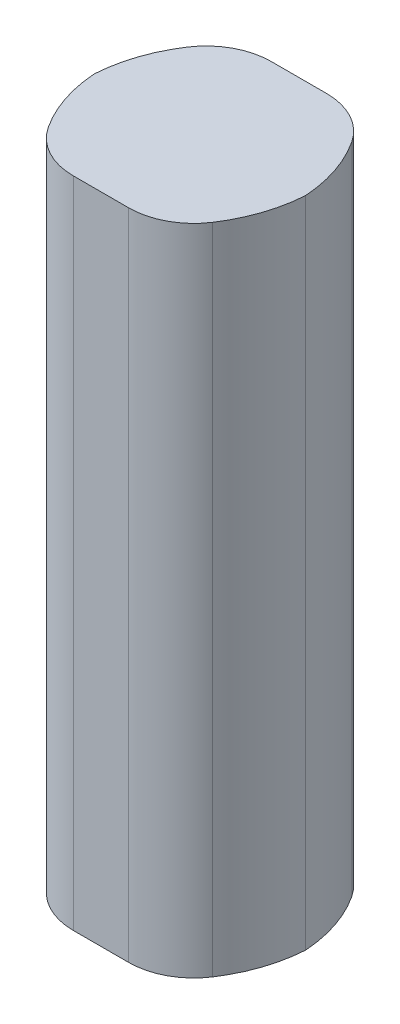
ISO-10303-21;
HEADER;
FILE_DESCRIPTION(('STEP AP214'),'2;1');
FILE_NAME('part.step','',(''),(''),'','','');
FILE_SCHEMA(('AUTOMOTIVE_DESIGN { 1 0 10303 214 1 1 1 1 }'));
ENDSEC;
DATA;
#1=APPLICATION_CONTEXT('core data for automotive mechanical design processes');
#2=APPLICATION_PROTOCOL_DEFINITION('international standard','automotive_design',2000,#1);
#3=PRODUCT_CONTEXT('',#1,'mechanical');
#4=PRODUCT('Part','Part','',(#3));
#5=PRODUCT_RELATED_PRODUCT_CATEGORY('part','',(#4));
#6=PRODUCT_DEFINITION_FORMATION('','',#4);
#7=PRODUCT_DEFINITION_CONTEXT('part definition',#1,'design');
#8=PRODUCT_DEFINITION('design','',#6,#7);
#9=PRODUCT_DEFINITION_SHAPE('','',#8);
#10=(LENGTH_UNIT() NAMED_UNIT(*) SI_UNIT(.MILLI.,.METRE.));
#11=(NAMED_UNIT(*) PLANE_ANGLE_UNIT() SI_UNIT($,.RADIAN.));
#12=(NAMED_UNIT(*) SI_UNIT($,.STERADIAN.) SOLID_ANGLE_UNIT());
#13=UNCERTAINTY_MEASURE_WITH_UNIT(LENGTH_MEASURE(1.E-05),#10,'distance_accuracy_value','');
#14=(GEOMETRIC_REPRESENTATION_CONTEXT(3) GLOBAL_UNCERTAINTY_ASSIGNED_CONTEXT((#13)) GLOBAL_UNIT_ASSIGNED_CONTEXT((#10,
#11,#12)) REPRESENTATION_CONTEXT('',''));
#15=CARTESIAN_POINT('',(0.,0.,0.));
#16=DIRECTION('',(0.,0.,1.));
#17=DIRECTION('',(1.,0.,0.));
#18=AXIS2_PLACEMENT_3D('',#15,#16,#17);
#19=CARTESIAN_POINT('',(-5.75438912917496,100.35,1.4159088829309));
#20=DIRECTION('',(0.,-1.,0.));
#21=DIRECTION('',(0.,0.,-1.));
#22=AXIS2_PLACEMENT_3D('',#19,#20,#21);
#23=CYLINDRICAL_SURFACE('',#22,22.);
#24=CARTESIAN_POINT('',(-5.75438912917496,0.,1.4159088829309));
#25=DIRECTION('',(0.,1.,0.));
#26=DIRECTION('',(0.,0.,1.));
#27=AXIS2_PLACEMENT_3D('',#24,#25,#26);
#28=CIRCLE('',#27,22.);
#29=CARTESIAN_POINT('',(12.59999250633,0.,-10.7132574024424));
#30=VERTEX_POINT('',#29);
#31=CARTESIAN_POINT('',(16.2,0.,0.));
#32=VERTEX_POINT('',#31);
#33=EDGE_CURVE('E177',#30,#32,#28,.F.);
#34=ORIENTED_EDGE('',*,*,#33,.F.);
#35=DIRECTION('',(0.,-1.,0.));
#36=VECTOR('',#35,1.);
#37=CARTESIAN_POINT('',(12.59999250633,100.35,-10.7132574024424));
#38=LINE('',#37,#36);
#39=CARTESIAN_POINT('',(12.59999250633,100.35,-10.7132574024424));
#40=VERTEX_POINT('',#39);
#41=EDGE_CURVE('E44',#30,#40,#38,.F.);
#42=ORIENTED_EDGE('',*,*,#41,.T.);
#43=CARTESIAN_POINT('',(-5.75438912917496,100.35,1.4159088829309));
#44=DIRECTION('',(0.,1.,0.));
#45=DIRECTION('',(0.,0.,1.));
#46=AXIS2_PLACEMENT_3D('',#43,#44,#45);
#47=CIRCLE('',#46,22.);
#48=CARTESIAN_POINT('',(16.2,100.35,0.));
#49=VERTEX_POINT('',#48);
#50=EDGE_CURVE('E174',#40,#49,#47,.F.);
#51=ORIENTED_EDGE('',*,*,#50,.T.);
#52=DIRECTION('',(0.,-1.,0.));
#53=VECTOR('',#52,1.);
#54=CARTESIAN_POINT('',(16.2,100.35,0.));
#55=LINE('',#54,#53);
#56=EDGE_CURVE('E136',#49,#32,#55,.T.);
#57=ORIENTED_EDGE('',*,*,#56,.T.);
#58=EDGE_LOOP('',(#34,#42,#51,#57));
#59=FACE_BOUND('',#58,.T.);
#60=ADVANCED_FACE('F36',(#59),#23,.T.);
#61=CARTESIAN_POINT('',(0.,100.35,-15.2));
#62=DIRECTION('',(0.,0.,-1.));
#63=DIRECTION('',(-1.,0.,0.));
#64=AXIS2_PLACEMENT_3D('',#61,#62,#63);
#65=PLANE('',#64);
#66=DIRECTION('',(1.,0.,0.));
#67=VECTOR('',#66,1.);
#68=CARTESIAN_POINT('',(0.,100.35,-15.2));
#69=LINE('',#68,#67);
#70=CARTESIAN_POINT('',(-4.25709176291859,100.35,-15.2));
#71=VERTEX_POINT('',#70);
#72=CARTESIAN_POINT('',(4.25709176291866,100.35,-15.2));
#73=VERTEX_POINT('',#72);
#74=EDGE_CURVE('E120',#71,#73,#69,.T.);
#75=ORIENTED_EDGE('',*,*,#74,.T.);
#76=DIRECTION('',(0.,-1.,0.));
#77=VECTOR('',#76,1.);
#78=CARTESIAN_POINT('',(4.25709176291866,100.35,-15.2));
#79=LINE('',#78,#77);
#80=CARTESIAN_POINT('',(4.25709176291866,0.,-15.2));
#81=VERTEX_POINT('',#80);
#82=EDGE_CURVE('E167',#73,#81,#79,.T.);
#83=ORIENTED_EDGE('',*,*,#82,.T.);
#84=DIRECTION('',(1.,0.,0.));
#85=VECTOR('',#84,1.);
#86=CARTESIAN_POINT('',(0.,0.,-15.2));
#87=LINE('',#86,#85);
#88=CARTESIAN_POINT('',(-4.25709176291859,0.,-15.2));
#89=VERTEX_POINT('',#88);
#90=EDGE_CURVE('E189',#89,#81,#87,.T.);
#91=ORIENTED_EDGE('',*,*,#90,.F.);
#92=DIRECTION('',(0.,1.,0.));
#93=VECTOR('',#92,1.);
#94=CARTESIAN_POINT('',(-4.25709176291859,100.35,-15.2));
#95=LINE('',#94,#93);
#96=EDGE_CURVE('E165',#89,#71,#95,.T.);
#97=ORIENTED_EDGE('',*,*,#96,.T.);
#98=EDGE_LOOP('',(#75,#83,#91,#97));
#99=FACE_BOUND('',#98,.T.);
#100=ADVANCED_FACE('F188',(#99),#65,.T.);
#101=CARTESIAN_POINT('',(5.75438912917503,100.35,1.41590888293091));
#102=DIRECTION('',(0.,-1.,0.));
#103=DIRECTION('',(0.,0.,-1.));
#104=AXIS2_PLACEMENT_3D('',#101,#102,#103);
#105=CYLINDRICAL_SURFACE('',#104,22.);
#106=CARTESIAN_POINT('',(5.75438912917503,100.35,1.41590888293091));
#107=DIRECTION('',(0.,1.,0.));
#108=DIRECTION('',(0.,0.,1.));
#109=AXIS2_PLACEMENT_3D('',#106,#107,#108);
#110=CIRCLE('',#109,22.);
#111=CARTESIAN_POINT('',(-12.5999925063299,100.35,-10.7132574024424));
#112=VERTEX_POINT('',#111);
#113=CARTESIAN_POINT('',(-16.2,100.35,0.));
#114=VERTEX_POINT('',#113);
#115=EDGE_CURVE('E112',#112,#114,#110,.T.);
#116=ORIENTED_EDGE('',*,*,#115,.F.);
#117=DIRECTION('',(0.,-1.,0.));
#118=VECTOR('',#117,1.);
#119=CARTESIAN_POINT('',(-12.5999925063299,100.35,-10.7132574024424));
#120=LINE('',#119,#118);
#121=CARTESIAN_POINT('',(-12.5999925063299,0.,-10.7132574024424));
#122=VERTEX_POINT('',#121);
#123=EDGE_CURVE('E12',#112,#122,#120,.T.);
#124=ORIENTED_EDGE('',*,*,#123,.T.);
#125=CARTESIAN_POINT('',(5.75438912917503,0.,1.41590888293091));
#126=DIRECTION('',(0.,1.,0.));
#127=DIRECTION('',(0.,0.,1.));
#128=AXIS2_PLACEMENT_3D('',#125,#126,#127);
#129=CIRCLE('',#128,22.);
#130=CARTESIAN_POINT('',(-16.2,0.,0.));
#131=VERTEX_POINT('',#130);
#132=EDGE_CURVE('E133',#122,#131,#129,.T.);
#133=ORIENTED_EDGE('',*,*,#132,.T.);
#134=DIRECTION('',(0.,-1.,0.));
#135=VECTOR('',#134,1.);
#136=CARTESIAN_POINT('',(-16.2,100.35,0.));
#137=LINE('',#136,#135);
#138=EDGE_CURVE('E126',#114,#131,#137,.T.);
#139=ORIENTED_EDGE('',*,*,#138,.F.);
#140=EDGE_LOOP('',(#116,#124,#133,#139));
#141=FACE_BOUND('',#140,.T.);
#142=ADVANCED_FACE('F131',(#141),#105,.T.);
#143=CARTESIAN_POINT('',(5.75438912917503,100.35,-1.41590888293091));
#144=DIRECTION('',(0.,-1.,0.));
#145=DIRECTION('',(0.,0.,-1.));
#146=AXIS2_PLACEMENT_3D('',#143,#144,#145);
#147=CYLINDRICAL_SURFACE('',#146,22.);
#148=CARTESIAN_POINT('',(5.75438912917503,0.,-1.41590888293091));
#149=DIRECTION('',(0.,1.,0.));
#150=DIRECTION('',(0.,0.,1.));
#151=AXIS2_PLACEMENT_3D('',#148,#149,#150);
#152=CIRCLE('',#151,22.);
#153=CARTESIAN_POINT('',(-12.59999250633,0.,10.7132574024424));
#154=VERTEX_POINT('',#153);
#155=EDGE_CURVE('E195',#154,#131,#152,.F.);
#156=ORIENTED_EDGE('',*,*,#155,.F.);
#157=DIRECTION('',(0.,-1.,0.));
#158=VECTOR('',#157,1.);
#159=CARTESIAN_POINT('',(-12.59999250633,100.35,10.7132574024424));
#160=LINE('',#159,#158);
#161=CARTESIAN_POINT('',(-12.59999250633,100.35,10.7132574024424));
#162=VERTEX_POINT('',#161);
#163=EDGE_CURVE('E128',#154,#162,#160,.F.);
#164=ORIENTED_EDGE('',*,*,#163,.T.);
#165=CARTESIAN_POINT('',(5.75438912917503,100.35,-1.41590888293091));
#166=DIRECTION('',(0.,1.,0.));
#167=DIRECTION('',(0.,0.,1.));
#168=AXIS2_PLACEMENT_3D('',#165,#166,#167);
#169=CIRCLE('',#168,22.);
#170=EDGE_CURVE('E115',#162,#114,#169,.F.);
#171=ORIENTED_EDGE('',*,*,#170,.T.);
#172=ORIENTED_EDGE('',*,*,#138,.T.);
#173=EDGE_LOOP('',(#156,#164,#171,#172));
#174=FACE_BOUND('',#173,.T.);
#175=ADVANCED_FACE('F125',(#174),#147,.T.);
#176=CARTESIAN_POINT('',(0.,100.35,15.2));
#177=DIRECTION('',(0.,0.,-1.));
#178=DIRECTION('',(-1.,0.,0.));
#179=AXIS2_PLACEMENT_3D('',#176,#177,#178);
#180=PLANE('',#179);
#181=DIRECTION('',(1.,0.,0.));
#182=VECTOR('',#181,1.);
#183=CARTESIAN_POINT('',(0.,100.35,15.2));
#184=LINE('',#183,#182);
#185=CARTESIAN_POINT('',(-4.2570917629186,100.35,15.2));
#186=VERTEX_POINT('',#185);
#187=CARTESIAN_POINT('',(4.25709176291866,100.35,15.2));
#188=VERTEX_POINT('',#187);
#189=EDGE_CURVE('E129',#186,#188,#184,.T.);
#190=ORIENTED_EDGE('',*,*,#189,.F.);
#191=DIRECTION('',(0.,1.,0.));
#192=VECTOR('',#191,1.);
#193=CARTESIAN_POINT('',(-4.2570917629186,0.,15.2));
#194=LINE('',#193,#192);
#195=CARTESIAN_POINT('',(-4.2570917629186,0.,15.2));
#196=VERTEX_POINT('',#195);
#197=EDGE_CURVE('E138',#186,#196,#194,.F.);
#198=ORIENTED_EDGE('',*,*,#197,.T.);
#199=DIRECTION('',(1.,0.,0.));
#200=VECTOR('',#199,1.);
#201=CARTESIAN_POINT('',(0.,0.,15.2));
#202=LINE('',#201,#200);
#203=CARTESIAN_POINT('',(4.25709176291866,0.,15.2));
#204=VERTEX_POINT('',#203);
#205=EDGE_CURVE('E201',#196,#204,#202,.T.);
#206=ORIENTED_EDGE('',*,*,#205,.T.);
#207=DIRECTION('',(0.,-1.,0.));
#208=VECTOR('',#207,1.);
#209=CARTESIAN_POINT('',(4.25709176291866,100.35,15.2));
#210=LINE('',#209,#208);
#211=EDGE_CURVE('E135',#204,#188,#210,.F.);
#212=ORIENTED_EDGE('',*,*,#211,.T.);
#213=EDGE_LOOP('',(#190,#198,#206,#212));
#214=FACE_BOUND('',#213,.T.);
#215=ADVANCED_FACE('F211',(#214),#180,.F.);
#216=CARTESIAN_POINT('',(-5.75438912917496,100.35,-1.41590888293092));
#217=DIRECTION('',(0.,-1.,0.));
#218=DIRECTION('',(0.,0.,-1.));
#219=AXIS2_PLACEMENT_3D('',#216,#217,#218);
#220=CYLINDRICAL_SURFACE('',#219,22.);
#221=CARTESIAN_POINT('',(-5.75438912917496,100.35,-1.41590888293092));
#222=DIRECTION('',(0.,1.,0.));
#223=DIRECTION('',(0.,0.,1.));
#224=AXIS2_PLACEMENT_3D('',#221,#222,#223);
#225=CIRCLE('',#224,22.);
#226=CARTESIAN_POINT('',(12.59999250633,100.35,10.7132574024424));
#227=VERTEX_POINT('',#226);
#228=EDGE_CURVE('E141',#227,#49,#225,.T.);
#229=ORIENTED_EDGE('',*,*,#228,.F.);
#230=DIRECTION('',(0.,-1.,0.));
#231=VECTOR('',#230,1.);
#232=CARTESIAN_POINT('',(12.59999250633,100.35,10.7132574024424));
#233=LINE('',#232,#231);
#234=CARTESIAN_POINT('',(12.59999250633,0.,10.7132574024424));
#235=VERTEX_POINT('',#234);
#236=EDGE_CURVE('E162',#227,#235,#233,.T.);
#237=ORIENTED_EDGE('',*,*,#236,.T.);
#238=CARTESIAN_POINT('',(-5.75438912917496,0.,-1.41590888293092));
#239=DIRECTION('',(0.,1.,0.));
#240=DIRECTION('',(0.,0.,1.));
#241=AXIS2_PLACEMENT_3D('',#238,#239,#240);
#242=CIRCLE('',#241,22.);
#243=EDGE_CURVE('E181',#235,#32,#242,.T.);
#244=ORIENTED_EDGE('',*,*,#243,.T.);
#245=ORIENTED_EDGE('',*,*,#56,.F.);
#246=EDGE_LOOP('',(#229,#237,#244,#245));
#247=FACE_BOUND('',#246,.T.);
#248=ADVANCED_FACE('F205',(#247),#220,.T.);
#249=CARTESIAN_POINT('',(0.,100.35,0.));
#250=DIRECTION('',(0.,1.,0.));
#251=DIRECTION('',(0.,0.,1.));
#252=AXIS2_PLACEMENT_3D('',#249,#250,#251);
#253=PLANE('',#252);
#254=ORIENTED_EDGE('',*,*,#170,.F.);
#255=CARTESIAN_POINT('',(-4.2570917629186,100.35,5.19999999999999));
#256=DIRECTION('',(0.,1.,0.));
#257=DIRECTION('',(0.,0.,1.));
#258=AXIS2_PLACEMENT_3D('',#255,#256,#257);
#259=CIRCLE('',#258,10.);
#260=EDGE_CURVE('E160',#162,#186,#259,.T.);
#261=ORIENTED_EDGE('',*,*,#260,.T.);
#262=ORIENTED_EDGE('',*,*,#189,.T.);
#263=CARTESIAN_POINT('',(4.25709176291866,100.35,5.19999999999999));
#264=DIRECTION('',(0.,1.,0.));
#265=DIRECTION('',(0.,0.,1.));
#266=AXIS2_PLACEMENT_3D('',#263,#264,#265);
#267=CIRCLE('',#266,10.);
#268=EDGE_CURVE('E51',#188,#227,#267,.T.);
#269=ORIENTED_EDGE('',*,*,#268,.T.);
#270=ORIENTED_EDGE('',*,*,#228,.T.);
#271=ORIENTED_EDGE('',*,*,#50,.F.);
#272=CARTESIAN_POINT('',(4.25709176291866,100.35,-5.2));
#273=DIRECTION('',(0.,1.,0.));
#274=DIRECTION('',(0.,0.,1.));
#275=AXIS2_PLACEMENT_3D('',#272,#273,#274);
#276=CIRCLE('',#275,10.);
#277=EDGE_CURVE('E157',#40,#73,#276,.T.);
#278=ORIENTED_EDGE('',*,*,#277,.T.);
#279=ORIENTED_EDGE('',*,*,#74,.F.);
#280=CARTESIAN_POINT('',(-4.25709176291859,100.35,-5.2));
#281=DIRECTION('',(0.,1.,0.));
#282=DIRECTION('',(0.,0.,1.));
#283=AXIS2_PLACEMENT_3D('',#280,#281,#282);
#284=CIRCLE('',#283,10.);
#285=EDGE_CURVE('E58',#71,#112,#284,.T.);
#286=ORIENTED_EDGE('',*,*,#285,.T.);
#287=ORIENTED_EDGE('',*,*,#115,.T.);
#288=EDGE_LOOP('',(#254,#261,#262,#269,#270,#271,#278,#279,#286,#287));
#289=FACE_BOUND('',#288,.T.);
#290=ADVANCED_FACE('F114',(#289),#253,.T.);
#291=CARTESIAN_POINT('',(0.,0.,0.));
#292=DIRECTION('',(0.,1.,0.));
#293=DIRECTION('',(0.,0.,1.));
#294=AXIS2_PLACEMENT_3D('',#291,#292,#293);
#295=PLANE('',#294);
#296=ORIENTED_EDGE('',*,*,#205,.F.);
#297=CARTESIAN_POINT('',(-4.2570917629186,0.,5.19999999999999));
#298=DIRECTION('',(0.,1.,0.));
#299=DIRECTION('',(0.,0.,1.));
#300=AXIS2_PLACEMENT_3D('',#297,#298,#299);
#301=CIRCLE('',#300,10.);
#302=EDGE_CURVE('E153',#196,#154,#301,.F.);
#303=ORIENTED_EDGE('',*,*,#302,.T.);
#304=ORIENTED_EDGE('',*,*,#155,.T.);
#305=ORIENTED_EDGE('',*,*,#132,.F.);
#306=CARTESIAN_POINT('',(-4.25709176291859,0.,-5.2));
#307=DIRECTION('',(0.,1.,0.));
#308=DIRECTION('',(0.,0.,1.));
#309=AXIS2_PLACEMENT_3D('',#306,#307,#308);
#310=CIRCLE('',#309,10.);
#311=EDGE_CURVE('E147',#122,#89,#310,.F.);
#312=ORIENTED_EDGE('',*,*,#311,.T.);
#313=ORIENTED_EDGE('',*,*,#90,.T.);
#314=CARTESIAN_POINT('',(4.25709176291866,0.,-5.2));
#315=DIRECTION('',(0.,1.,0.));
#316=DIRECTION('',(0.,0.,1.));
#317=AXIS2_PLACEMENT_3D('',#314,#315,#316);
#318=CIRCLE('',#317,10.);
#319=EDGE_CURVE('E149',#81,#30,#318,.F.);
#320=ORIENTED_EDGE('',*,*,#319,.T.);
#321=ORIENTED_EDGE('',*,*,#33,.T.);
#322=ORIENTED_EDGE('',*,*,#243,.F.);
#323=CARTESIAN_POINT('',(4.25709176291866,0.,5.19999999999999));
#324=DIRECTION('',(0.,1.,0.));
#325=DIRECTION('',(0.,0.,1.));
#326=AXIS2_PLACEMENT_3D('',#323,#324,#325);
#327=CIRCLE('',#326,10.);
#328=EDGE_CURVE('E151',#235,#204,#327,.F.);
#329=ORIENTED_EDGE('',*,*,#328,.T.);
#330=EDGE_LOOP('',(#296,#303,#304,#305,#312,#313,#320,#321,#322,#329));
#331=FACE_BOUND('',#330,.T.);
#332=ADVANCED_FACE('F193',(#331),#295,.F.);
#333=CARTESIAN_POINT('',(-4.2570917629186,100.35,5.19999999999999));
#334=DIRECTION('',(0.,-1.,0.));
#335=DIRECTION('',(0.,0.,-1.));
#336=AXIS2_PLACEMENT_3D('',#333,#334,#335);
#337=CYLINDRICAL_SURFACE('',#336,10.);
#338=ORIENTED_EDGE('',*,*,#260,.F.);
#339=ORIENTED_EDGE('',*,*,#163,.F.);
#340=ORIENTED_EDGE('',*,*,#302,.F.);
#341=ORIENTED_EDGE('',*,*,#197,.F.);
#342=EDGE_LOOP('',(#338,#339,#340,#341));
#343=FACE_BOUND('',#342,.T.);
#344=ADVANCED_FACE('F215',(#343),#337,.T.);
#345=CARTESIAN_POINT('',(4.25709176291866,100.35,5.19999999999999));
#346=DIRECTION('',(0.,-1.,0.));
#347=DIRECTION('',(0.,0.,-1.));
#348=AXIS2_PLACEMENT_3D('',#345,#346,#347);
#349=CYLINDRICAL_SURFACE('',#348,10.);
#350=ORIENTED_EDGE('',*,*,#268,.F.);
#351=ORIENTED_EDGE('',*,*,#211,.F.);
#352=ORIENTED_EDGE('',*,*,#328,.F.);
#353=ORIENTED_EDGE('',*,*,#236,.F.);
#354=EDGE_LOOP('',(#350,#351,#352,#353));
#355=FACE_BOUND('',#354,.T.);
#356=ADVANCED_FACE('F213',(#355),#349,.T.);
#357=CARTESIAN_POINT('',(4.25709176291866,100.35,-5.2));
#358=DIRECTION('',(0.,-1.,0.));
#359=DIRECTION('',(0.,0.,-1.));
#360=AXIS2_PLACEMENT_3D('',#357,#358,#359);
#361=CYLINDRICAL_SURFACE('',#360,10.);
#362=ORIENTED_EDGE('',*,*,#277,.F.);
#363=ORIENTED_EDGE('',*,*,#41,.F.);
#364=ORIENTED_EDGE('',*,*,#319,.F.);
#365=ORIENTED_EDGE('',*,*,#82,.F.);
#366=EDGE_LOOP('',(#362,#363,#364,#365));
#367=FACE_BOUND('',#366,.T.);
#368=ADVANCED_FACE('F184',(#367),#361,.T.);
#369=CARTESIAN_POINT('',(-4.25709176291859,100.35,-5.2));
#370=DIRECTION('',(0.,-1.,0.));
#371=DIRECTION('',(0.,0.,-1.));
#372=AXIS2_PLACEMENT_3D('',#369,#370,#371);
#373=CYLINDRICAL_SURFACE('',#372,10.);
#374=ORIENTED_EDGE('',*,*,#285,.F.);
#375=ORIENTED_EDGE('',*,*,#96,.F.);
#376=ORIENTED_EDGE('',*,*,#311,.F.);
#377=ORIENTED_EDGE('',*,*,#123,.F.);
#378=EDGE_LOOP('',(#374,#375,#376,#377));
#379=FACE_BOUND('',#378,.T.);
#380=ADVANCED_FACE('F38',(#379),#373,.T.);
#381=CLOSED_SHELL('',(#60,#100,#142,#175,#215,#248,#290,#332,#344,#356,#368,#380));
#382=MANIFOLD_SOLID_BREP('B2',#381);
#383=ADVANCED_BREP_SHAPE_REPRESENTATION('',(#18,#382),#14);
#384=SHAPE_DEFINITION_REPRESENTATION(#9,#383);
ENDSEC;
END-ISO-10303-21;
